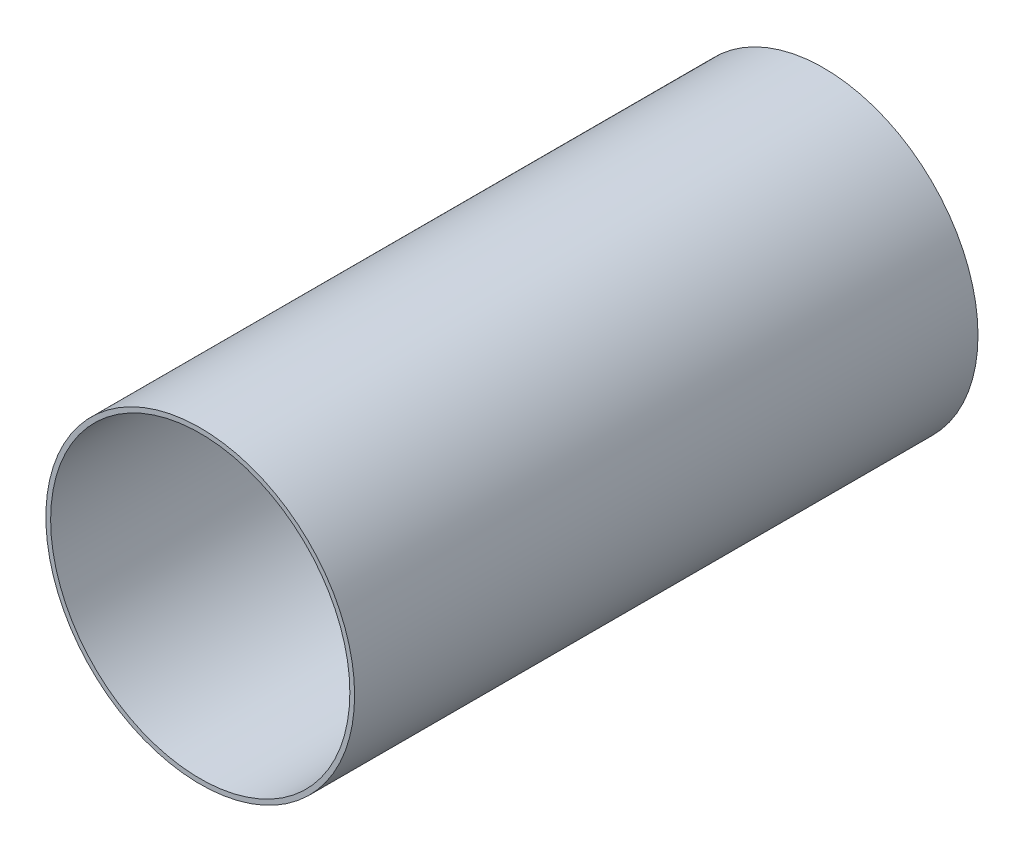
ISO-10303-21;
HEADER;
FILE_DESCRIPTION(('STEP AP214'),'2;1');
FILE_NAME('part.step','',(''),(''),'','','');
FILE_SCHEMA(('AUTOMOTIVE_DESIGN { 1 0 10303 214 1 1 1 1 }'));
ENDSEC;
DATA;
#1=APPLICATION_CONTEXT('core data for automotive mechanical design processes');
#2=APPLICATION_PROTOCOL_DEFINITION('international standard','automotive_design',2000,#1);
#3=PRODUCT_CONTEXT('',#1,'mechanical');
#4=PRODUCT('Part','Part','',(#3));
#5=PRODUCT_RELATED_PRODUCT_CATEGORY('part','',(#4));
#6=PRODUCT_DEFINITION_FORMATION('','',#4);
#7=PRODUCT_DEFINITION_CONTEXT('part definition',#1,'design');
#8=PRODUCT_DEFINITION('design','',#6,#7);
#9=PRODUCT_DEFINITION_SHAPE('','',#8);
#10=(LENGTH_UNIT() NAMED_UNIT(*) SI_UNIT(.MILLI.,.METRE.));
#11=(NAMED_UNIT(*) PLANE_ANGLE_UNIT() SI_UNIT($,.RADIAN.));
#12=(NAMED_UNIT(*) SI_UNIT($,.STERADIAN.) SOLID_ANGLE_UNIT());
#13=UNCERTAINTY_MEASURE_WITH_UNIT(LENGTH_MEASURE(1.E-05),#10,'distance_accuracy_value','');
#14=(GEOMETRIC_REPRESENTATION_CONTEXT(3) GLOBAL_UNCERTAINTY_ASSIGNED_CONTEXT((#13)) GLOBAL_UNIT_ASSIGNED_CONTEXT((#10,
#11,#12)) REPRESENTATION_CONTEXT('',''));
#15=CARTESIAN_POINT('',(0.,0.,0.));
#16=DIRECTION('',(0.,0.,1.));
#17=DIRECTION('',(1.,0.,0.));
#18=AXIS2_PLACEMENT_3D('',#15,#16,#17);
#19=CARTESIAN_POINT('',(0.,0.,200.));
#20=DIRECTION('',(0.,0.,1.));
#21=DIRECTION('',(1.,0.,0.));
#22=AXIS2_PLACEMENT_3D('',#19,#20,#21);
#23=PLANE('',#22);
#24=CARTESIAN_POINT('',(0.,0.,200.));
#25=DIRECTION('',(0.,0.,1.));
#26=DIRECTION('',(1.,0.,0.));
#27=AXIS2_PLACEMENT_3D('',#24,#25,#26);
#28=CIRCLE('',#27,49.53);
#29=CARTESIAN_POINT('',(49.53,0.,200.));
#30=VERTEX_POINT('',#29);
#31=EDGE_CURVE('E10',#30,#30,#28,.T.);
#32=ORIENTED_EDGE('',*,*,#31,.T.);
#33=EDGE_LOOP('',(#32));
#34=FACE_BOUND('',#33,.T.);
#35=CARTESIAN_POINT('',(0.,0.,200.));
#36=DIRECTION('',(0.,0.,1.));
#37=DIRECTION('',(1.,0.,0.));
#38=AXIS2_PLACEMENT_3D('',#35,#36,#37);
#39=CIRCLE('',#38,48.);
#40=CARTESIAN_POINT('',(48.,0.,200.));
#41=VERTEX_POINT('',#40);
#42=EDGE_CURVE('E56',#41,#41,#39,.T.);
#43=ORIENTED_EDGE('',*,*,#42,.F.);
#44=EDGE_LOOP('',(#43));
#45=FACE_BOUND('',#44,.T.);
#46=ADVANCED_FACE('F45',(#34,#45),#23,.T.);
#47=CARTESIAN_POINT('',(0.,0.,0.));
#48=DIRECTION('',(0.,0.,1.));
#49=DIRECTION('',(1.,0.,0.));
#50=AXIS2_PLACEMENT_3D('',#47,#48,#49);
#51=PLANE('',#50);
#52=CARTESIAN_POINT('',(0.,0.,0.));
#53=DIRECTION('',(0.,0.,1.));
#54=DIRECTION('',(1.,0.,0.));
#55=AXIS2_PLACEMENT_3D('',#52,#53,#54);
#56=CIRCLE('',#55,49.53);
#57=CARTESIAN_POINT('',(49.53,0.,0.));
#58=VERTEX_POINT('',#57);
#59=EDGE_CURVE('E49',#58,#58,#56,.T.);
#60=ORIENTED_EDGE('',*,*,#59,.F.);
#61=EDGE_LOOP('',(#60));
#62=FACE_BOUND('',#61,.T.);
#63=CARTESIAN_POINT('',(0.,0.,0.));
#64=DIRECTION('',(0.,0.,1.));
#65=DIRECTION('',(1.,0.,0.));
#66=AXIS2_PLACEMENT_3D('',#63,#64,#65);
#67=CIRCLE('',#66,48.);
#68=CARTESIAN_POINT('',(48.,0.,0.));
#69=VERTEX_POINT('',#68);
#70=EDGE_CURVE('E58',#69,#69,#67,.T.);
#71=ORIENTED_EDGE('',*,*,#70,.T.);
#72=EDGE_LOOP('',(#71));
#73=FACE_BOUND('',#72,.T.);
#74=ADVANCED_FACE('F68',(#62,#73),#51,.F.);
#75=CARTESIAN_POINT('',(0.,0.,200.));
#76=DIRECTION('',(0.,0.,-1.));
#77=DIRECTION('',(-1.,0.,0.));
#78=AXIS2_PLACEMENT_3D('',#75,#76,#77);
#79=CYLINDRICAL_SURFACE('',#78,49.53);
#80=ORIENTED_EDGE('',*,*,#31,.F.);
#81=EDGE_LOOP('',(#80));
#82=FACE_BOUND('',#81,.T.);
#83=ORIENTED_EDGE('',*,*,#59,.T.);
#84=EDGE_LOOP('',(#83));
#85=FACE_BOUND('',#84,.T.);
#86=ADVANCED_FACE('F47',(#82,#85),#79,.T.);
#87=CARTESIAN_POINT('',(0.,0.,200.));
#88=DIRECTION('',(0.,0.,-1.));
#89=DIRECTION('',(-1.,0.,0.));
#90=AXIS2_PLACEMENT_3D('',#87,#88,#89);
#91=CYLINDRICAL_SURFACE('',#90,48.);
#92=ORIENTED_EDGE('',*,*,#42,.T.);
#93=EDGE_LOOP('',(#92));
#94=FACE_BOUND('',#93,.T.);
#95=ORIENTED_EDGE('',*,*,#70,.F.);
#96=EDGE_LOOP('',(#95));
#97=FACE_BOUND('',#96,.T.);
#98=ADVANCED_FACE('F64',(#94,#97),#91,.F.);
#99=CLOSED_SHELL('',(#46,#74,#86,#98));
#100=MANIFOLD_SOLID_BREP('B2',#99);
#101=ADVANCED_BREP_SHAPE_REPRESENTATION('',(#18,#100),#14);
#102=SHAPE_DEFINITION_REPRESENTATION(#9,#101);
ENDSEC;
END-ISO-10303-21;
